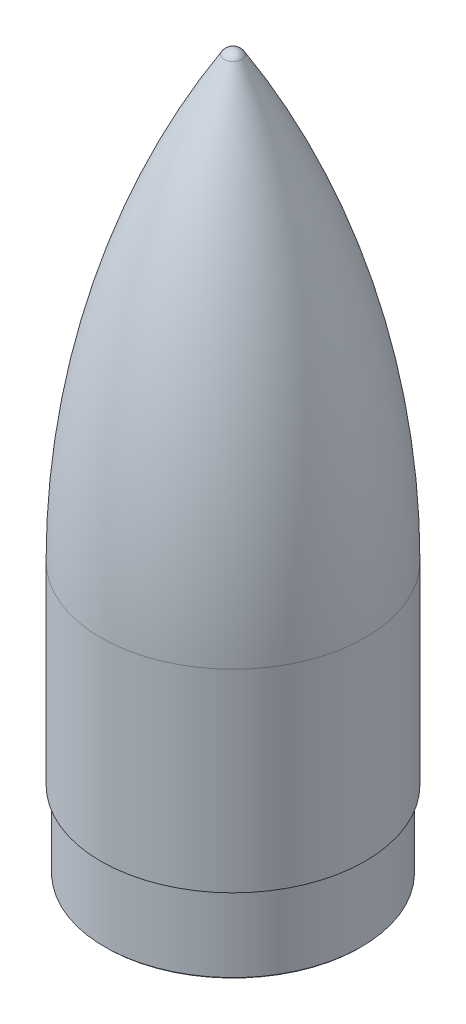
ISO-10303-21;
HEADER;
FILE_DESCRIPTION(('STEP AP214'),'2;1');
FILE_NAME('part.step','',(''),(''),'','','');
FILE_SCHEMA(('AUTOMOTIVE_DESIGN { 1 0 10303 214 1 1 1 1 }'));
ENDSEC;
DATA;
#1=APPLICATION_CONTEXT('core data for automotive mechanical design processes');
#2=APPLICATION_PROTOCOL_DEFINITION('international standard','automotive_design',2000,#1);
#3=PRODUCT_CONTEXT('',#1,'mechanical');
#4=PRODUCT('Part','Part','',(#3));
#5=PRODUCT_RELATED_PRODUCT_CATEGORY('part','',(#4));
#6=PRODUCT_DEFINITION_FORMATION('','',#4);
#7=PRODUCT_DEFINITION_CONTEXT('part definition',#1,'design');
#8=PRODUCT_DEFINITION('design','',#6,#7);
#9=PRODUCT_DEFINITION_SHAPE('','',#8);
#10=(LENGTH_UNIT() NAMED_UNIT(*) SI_UNIT(.MILLI.,.METRE.));
#11=(NAMED_UNIT(*) PLANE_ANGLE_UNIT() SI_UNIT($,.RADIAN.));
#12=(NAMED_UNIT(*) SI_UNIT($,.STERADIAN.) SOLID_ANGLE_UNIT());
#13=UNCERTAINTY_MEASURE_WITH_UNIT(LENGTH_MEASURE(1.E-05),#10,'distance_accuracy_value','');
#14=(GEOMETRIC_REPRESENTATION_CONTEXT(3) GLOBAL_UNCERTAINTY_ASSIGNED_CONTEXT((#13)) GLOBAL_UNIT_ASSIGNED_CONTEXT((#10,
#11,#12)) REPRESENTATION_CONTEXT('',''));
#15=CARTESIAN_POINT('',(0.,0.,0.));
#16=DIRECTION('',(0.,0.,1.));
#17=DIRECTION('',(1.,0.,0.));
#18=AXIS2_PLACEMENT_3D('',#15,#16,#17);
#19=CARTESIAN_POINT('',(49.7,0.,0.));
#20=DIRECTION('',(0.,-1.,0.));
#21=DIRECTION('',(0.,0.,-1.));
#22=AXIS2_PLACEMENT_3D('',#19,#20,#21);
#23=PLANE('',#22);
#24=CARTESIAN_POINT('',(0.,0.,0.));
#25=DIRECTION('',(0.,-1.,0.));
#26=DIRECTION('',(0.,0.,-1.));
#27=AXIS2_PLACEMENT_3D('',#24,#25,#26);
#28=CIRCLE('',#27,49.1999999999999);
#29=CARTESIAN_POINT('',(0.,0.,-49.1999999999999));
#30=VERTEX_POINT('',#29);
#31=EDGE_CURVE('E121',#30,#30,#28,.T.);
#32=ORIENTED_EDGE('',*,*,#31,.T.);
#33=EDGE_LOOP('',(#32));
#34=FACE_BOUND('',#33,.T.);
#35=CARTESIAN_POINT('',(0.,0.,0.));
#36=DIRECTION('',(0.,-1.,0.));
#37=DIRECTION('',(0.,0.,-1.));
#38=AXIS2_PLACEMENT_3D('',#35,#36,#37);
#39=CIRCLE('',#38,46.7);
#40=CARTESIAN_POINT('',(0.,0.,-46.7));
#41=VERTEX_POINT('',#40);
#42=EDGE_CURVE('E139',#41,#41,#39,.T.);
#43=ORIENTED_EDGE('',*,*,#42,.F.);
#44=EDGE_LOOP('',(#43));
#45=FACE_BOUND('',#44,.T.);
#46=ADVANCED_FACE('F34',(#34,#45),#23,.T.);
#47=CARTESIAN_POINT('',(0.,0.,0.));
#48=DIRECTION('',(0.,-1.,0.));
#49=DIRECTION('',(0.,0.,-1.));
#50=AXIS2_PLACEMENT_3D('',#47,#48,#49);
#51=CYLINDRICAL_SURFACE('',#50,49.7);
#52=CARTESIAN_POINT('',(0.,0.50000000000003,0.));
#53=DIRECTION('',(0.,-1.,0.));
#54=DIRECTION('',(0.,0.,-1.));
#55=AXIS2_PLACEMENT_3D('',#52,#53,#54);
#56=CIRCLE('',#55,49.7);
#57=CARTESIAN_POINT('',(0.,0.50000000000003,-49.7));
#58=VERTEX_POINT('',#57);
#59=EDGE_CURVE('E118',#58,#58,#56,.F.);
#60=ORIENTED_EDGE('',*,*,#59,.T.);
#61=EDGE_LOOP('',(#60));
#62=FACE_BOUND('',#61,.T.);
#63=CARTESIAN_POINT('',(0.,30.,0.));
#64=DIRECTION('',(0.,-1.,0.));
#65=DIRECTION('',(0.,0.,-1.));
#66=AXIS2_PLACEMENT_3D('',#63,#64,#65);
#67=CIRCLE('',#66,49.7);
#68=CARTESIAN_POINT('',(0.,30.,-49.7));
#69=VERTEX_POINT('',#68);
#70=EDGE_CURVE('E127',#69,#69,#67,.T.);
#71=ORIENTED_EDGE('',*,*,#70,.T.);
#72=EDGE_LOOP('',(#71));
#73=FACE_BOUND('',#72,.T.);
#74=ADVANCED_FACE('F158',(#62,#73),#51,.T.);
#75=CARTESIAN_POINT('',(49.7,30.,0.));
#76=DIRECTION('',(0.,-1.,0.));
#77=DIRECTION('',(0.,0.,-1.));
#78=AXIS2_PLACEMENT_3D('',#75,#76,#77);
#79=PLANE('',#78);
#80=CARTESIAN_POINT('',(0.,30.,0.));
#81=DIRECTION('',(0.,-1.,0.));
#82=DIRECTION('',(0.,0.,-1.));
#83=AXIS2_PLACEMENT_3D('',#80,#81,#82);
#84=CIRCLE('',#83,51.2);
#85=CARTESIAN_POINT('',(0.,30.,-51.2));
#86=VERTEX_POINT('',#85);
#87=EDGE_CURVE('E130',#86,#86,#84,.T.);
#88=ORIENTED_EDGE('',*,*,#87,.T.);
#89=EDGE_LOOP('',(#88));
#90=FACE_BOUND('',#89,.T.);
#91=ORIENTED_EDGE('',*,*,#70,.F.);
#92=EDGE_LOOP('',(#91));
#93=FACE_BOUND('',#92,.T.);
#94=ADVANCED_FACE('F164',(#90,#93),#79,.T.);
#95=CARTESIAN_POINT('',(0.,0.,0.));
#96=DIRECTION('',(0.,-1.,0.));
#97=DIRECTION('',(0.,0.,-1.));
#98=AXIS2_PLACEMENT_3D('',#95,#96,#97);
#99=CYLINDRICAL_SURFACE('',#98,51.2);
#100=CARTESIAN_POINT('',(0.,54.,0.));
#101=DIRECTION('',(0.,0.5,0.866025403784439));
#102=DIRECTION('',(0.,-0.866025403784439,0.5));
#103=AXIS2_PLACEMENT_3D('',#100,#101,#102);
#104=ELLIPSE('',#103,102.4,51.2);
#105=CARTESIAN_POINT('',(-51.2,54.,0.));
#106=VERTEX_POINT('',#105);
#107=CARTESIAN_POINT('',(-51.1706947382972,51.,1.73205080756888));
#108=VERTEX_POINT('',#107);
#109=EDGE_CURVE('E79',#106,#108,#104,.T.);
#110=ORIENTED_EDGE('',*,*,#109,.T.);
#111=CARTESIAN_POINT('',(-51.1706947382972,51.,1.73205080756888));
#112=CARTESIAN_POINT('',(-51.1697427270834,50.9512981561705,1.76016838132904));
#113=CARTESIAN_POINT('',(-51.1688381000891,50.901432614944,1.78621821485471));
#114=CARTESIAN_POINT('',(-51.1671468144892,50.7996871430818,1.83402923090942));
#115=CARTESIAN_POINT('',(-51.1663601506634,50.7478073017126,1.85579060322848));
#116=CARTESIAN_POINT('',(-51.1642140484645,50.5897762579306,1.91435383585504));
#117=CARTESIAN_POINT('',(-51.1630653365852,50.4810772316997,1.94452485163657));
#118=CARTESIAN_POINT('',(-51.1614645940316,50.2601552139265,1.98619702625711));
#119=CARTESIAN_POINT('',(-51.1610128996041,50.1479305482063,1.99768917440332));
#120=CARTESIAN_POINT('',(-51.1608569670757,49.9231520314851,2.00167918453755));
#121=CARTESIAN_POINT('',(-51.1611525758249,49.8105982526534,1.99418093835364));
#122=CARTESIAN_POINT('',(-51.1624576923682,49.5883873435847,1.96040901332794));
#123=CARTESIAN_POINT('',(-51.163466980732,49.4787293337527,1.93414110543971));
#124=CARTESIAN_POINT('',(-51.1660854771632,49.2653621369059,1.86358107581268));
#125=CARTESIAN_POINT('',(-51.1676947793993,49.1616538866202,1.81928612473603));
#126=CARTESIAN_POINT('',(-51.1713324823789,48.9631125556022,1.71391343164986));
#127=CARTESIAN_POINT('',(-51.1733610154051,48.8682822899579,1.65283039036692));
#128=CARTESIAN_POINT('',(-51.177608162499,48.6902239788753,1.51562481062882));
#129=CARTESIAN_POINT('',(-51.1798267653368,48.6069952487498,1.43950316034803));
#130=CARTESIAN_POINT('',(-51.1842058495242,48.454438230109,1.27431827930633));
#131=CARTESIAN_POINT('',(-51.1863662912608,48.3851192178467,1.1852464800407));
#132=CARTESIAN_POINT('',(-51.1903840727952,48.2624167481332,0.996721645438037));
#133=CARTESIAN_POINT('',(-51.1922414064547,48.2090336133824,0.897268399932431));
#134=CARTESIAN_POINT('',(-51.1954434073345,48.1197266061165,0.690811722155504));
#135=CARTESIAN_POINT('',(-51.1967881186416,48.0838012321181,0.583808940101248));
#136=CARTESIAN_POINT('',(-51.1988134499465,48.0304272110618,0.365285053247779));
#137=CARTESIAN_POINT('',(-51.199494076732,48.0129783751491,0.253763994643456));
#138=CARTESIAN_POINT('',(-51.2001142735274,47.9970604366005,0.0294492146832383));
#139=CARTESIAN_POINT('',(-51.2000543429302,47.9985785436659,-0.0833435977948391));
#140=CARTESIAN_POINT('',(-51.1992013943829,48.0205201067083,-0.30707213517148));
#141=CARTESIAN_POINT('',(-51.1984083773477,48.0409435390893,-0.418007862387705));
#142=CARTESIAN_POINT('',(-51.1961788447621,48.1001068123995,-0.634849018118409));
#143=CARTESIAN_POINT('',(-51.1947424712293,48.1388426110694,-0.740755551099095));
#144=CARTESIAN_POINT('',(-51.1913879268754,48.2335275988252,-0.944564034600044));
#145=CARTESIAN_POINT('',(-51.1894697528584,48.2894769020969,-1.04246593201606));
#146=CARTESIAN_POINT('',(-51.185366212707,48.4170387786355,-1.22754751353424));
#147=CARTESIAN_POINT('',(-51.1831806922709,48.4886604163369,-1.31472094681927));
#148=CARTESIAN_POINT('',(-51.1787894601471,48.6455179778092,-1.47581063756051));
#149=CARTESIAN_POINT('',(-51.1765837484364,48.730753917089,-1.54972687991427));
#150=CARTESIAN_POINT('',(-51.1723995832855,48.9124709505006,-1.68224016482551));
#151=CARTESIAN_POINT('',(-51.1704212416992,49.0089575327271,-1.7408296853872));
#152=CARTESIAN_POINT('',(-51.1669163966837,49.2104035681261,-1.84097504280213));
#153=CARTESIAN_POINT('',(-51.1653898800052,49.3153627727334,-1.88253137914858));
#154=CARTESIAN_POINT('',(-51.1629615891522,49.530724576811,-1.9474145208519));
#155=CARTESIAN_POINT('',(-51.1620595234269,49.6411246101793,-1.97074983409958));
#156=CARTESIAN_POINT('',(-51.1609808812591,49.864307239385,-1.99855770548171));
#157=CARTESIAN_POINT('',(-51.160804460006,49.9770903396923,-2.00302622868704));
#158=CARTESIAN_POINT('',(-51.1611970396326,50.2017696304485,-1.99297290901983));
#159=CARTESIAN_POINT('',(-51.1617659164243,50.3136659654185,-1.97845422741181));
#160=CARTESIAN_POINT('',(-51.1635850580286,50.5333593704557,-1.9308357519898));
#161=CARTESIAN_POINT('',(-51.164834529594,50.6411610567518,-1.89775758828383));
#162=CARTESIAN_POINT('',(-51.166990358,50.7892083869755,-1.83831393687303));
#163=CARTESIAN_POINT('',(-51.1676770201702,50.8324562018554,-1.81913619704325));
#164=CARTESIAN_POINT('',(-51.1691297442726,50.9174062872799,-1.77780434919564));
#165=CARTESIAN_POINT('',(-51.1698956587564,50.9591112387515,-1.75565574647588));
#166=CARTESIAN_POINT('',(-51.1706947382973,51.,-1.7320508075689));
#167=B_SPLINE_CURVE_WITH_KNOTS('',3,(#111,#112,#113,#114,#115,#116,#117,#118,#119,#120,#121,
#122,#123,#124,#125,#126,#127,#128,#129,#130,#131,#132,#133,#134,#135,#136,#137,#138,#139,#140,
#141,#142,#143,#144,#145,#146,#147,#148,#149,#150,#151,#152,#153,#154,#155,#156,#157,#158,#159,
#160,#161,#162,#163,#164,#165,#166),.UNSPECIFIED.,.F.,.F.,(4,2,2,2,2,2,2,2,2,2,2,2,2,2,2,2,2,2,
2,2,2,2,2,2,2,2,2,4),(0.,0.168628145473781,0.337248826467912,0.673955840980249,1.01082523492762,
1.34762559757183,1.68432245151099,2.0210721702904,2.3579283087058,2.69476455847371,
3.03182469985251,3.36889166621396,3.70592963744686,4.04296416367046,4.37977142399021,
4.71657826393983,5.05331079206724,5.39004555396007,5.72697559091441,6.06390601169347,
6.4010014811084,6.73808706458861,7.07501515937384,7.41201530733527,7.74895935377974,
8.08551152276758,8.22735740343669,8.36894397060716),.UNSPECIFIED.);
#168=CARTESIAN_POINT('',(-51.1706947382972,51.,-1.73205080756888));
#169=VERTEX_POINT('',#168);
#170=EDGE_CURVE('E68',#108,#169,#167,.T.);
#171=ORIENTED_EDGE('',*,*,#170,.T.);
#172=CARTESIAN_POINT('',(0.,54.,0.));
#173=DIRECTION('',(0.,0.5,-0.866025403784439));
#174=DIRECTION('',(0.,-0.866025403784439,-0.5));
#175=AXIS2_PLACEMENT_3D('',#172,#173,#174);
#176=ELLIPSE('',#175,102.4,51.2);
#177=EDGE_CURVE('E83',#169,#106,#176,.T.);
#178=ORIENTED_EDGE('',*,*,#177,.T.);
#179=EDGE_LOOP('',(#110,#171,#178));
#180=FACE_BOUND('',#179,.T.);
#181=CARTESIAN_POINT('',(0.,105.,0.));
#182=DIRECTION('',(0.,-1.,0.));
#183=DIRECTION('',(0.,0.,-1.));
#184=AXIS2_PLACEMENT_3D('',#181,#182,#183);
#185=CIRCLE('',#184,51.2);
#186=CARTESIAN_POINT('',(0.,105.,-51.2));
#187=VERTEX_POINT('',#186);
#188=EDGE_CURVE('E133',#187,#187,#185,.T.);
#189=ORIENTED_EDGE('',*,*,#188,.T.);
#190=EDGE_LOOP('',(#189));
#191=FACE_BOUND('',#190,.T.);
#192=ORIENTED_EDGE('',*,*,#87,.F.);
#193=EDGE_LOOP('',(#192));
#194=FACE_BOUND('',#193,.T.);
#195=ADVANCED_FACE('F81',(#180,#191,#194),#99,.T.);
#196=CARTESIAN_POINT('',(0.,105.,0.));
#197=DIRECTION('',(0.,-1.,0.));
#198=DIRECTION('',(0.,0.,-1.));
#199=AXIS2_PLACEMENT_3D('',#196,#197,#198);
#200=DEGENERATE_TOROIDAL_SURFACE('',#199,275.383050847458,326.583050847458,.F.);
#201=CARTESIAN_POINT('',(0.,275.083184464387,0.));
#202=DIRECTION('',(0.,-1.,0.));
#203=DIRECTION('',(0.,0.,-1.));
#204=AXIS2_PLACEMENT_3D('',#201,#202,#203);
#205=CIRCLE('',#204,3.41472436476742);
#206=CARTESIAN_POINT('',(0.,275.083184464387,-3.41472436476742));
#207=VERTEX_POINT('',#206);
#208=EDGE_CURVE('E136',#207,#207,#205,.T.);
#209=ORIENTED_EDGE('',*,*,#208,.T.);
#210=EDGE_LOOP('',(#209));
#211=FACE_BOUND('',#210,.T.);
#212=ORIENTED_EDGE('',*,*,#188,.F.);
#213=EDGE_LOOP('',(#212));
#214=FACE_BOUND('',#213,.T.);
#215=ADVANCED_FACE('F229',(#211,#214),#200,.F.);
#216=CARTESIAN_POINT('',(0.,273.,0.));
#217=DIRECTION('',(0.,-1.,0.));
#218=DIRECTION('',(1.,0.,0.));
#219=AXIS2_PLACEMENT_3D('',#216,#217,#218);
#220=SPHERICAL_SURFACE('',#219,4.00000000000001);
#221=ORIENTED_EDGE('',*,*,#208,.F.);
#222=EDGE_LOOP('',(#221));
#223=FACE_BOUND('',#222,.T.);
#224=ADVANCED_FACE('F102',(#223),#220,.T.);
#225=CARTESIAN_POINT('',(0.,0.,0.));
#226=DIRECTION('',(0.,-1.,0.));
#227=DIRECTION('',(0.,0.,-1.));
#228=AXIS2_PLACEMENT_3D('',#225,#226,#227);
#229=CYLINDRICAL_SURFACE('',#228,46.7);
#230=CARTESIAN_POINT('',(0.,33.,0.));
#231=DIRECTION('',(0.,-1.,0.));
#232=DIRECTION('',(0.,0.,-1.));
#233=AXIS2_PLACEMENT_3D('',#230,#231,#232);
#234=CIRCLE('',#233,46.7);
#235=CARTESIAN_POINT('',(0.,33.,-46.7));
#236=VERTEX_POINT('',#235);
#237=EDGE_CURVE('E142',#236,#236,#234,.T.);
#238=ORIENTED_EDGE('',*,*,#237,.F.);
#239=EDGE_LOOP('',(#238));
#240=FACE_BOUND('',#239,.T.);
#241=ORIENTED_EDGE('',*,*,#42,.T.);
#242=EDGE_LOOP('',(#241));
#243=FACE_BOUND('',#242,.T.);
#244=ADVANCED_FACE('F98',(#240,#243),#229,.F.);
#245=CARTESIAN_POINT('',(0.,0.,0.));
#246=DIRECTION('',(0.,-1.,0.));
#247=DIRECTION('',(0.,0.,-1.));
#248=AXIS2_PLACEMENT_3D('',#245,#246,#247);
#249=CYLINDRICAL_SURFACE('',#248,48.2);
#250=CARTESIAN_POINT('',(-48.1688696151363,51.,-1.73205080756888));
#251=CARTESIAN_POINT('',(-48.1678583503535,50.9513017356797,-1.76016631244853));
#252=CARTESIAN_POINT('',(-48.1668974092647,50.9014398525083,-1.78621443865151));
#253=CARTESIAN_POINT('',(-48.1651008190713,50.7997017225741,-1.83402275540586));
#254=CARTESIAN_POINT('',(-48.1642651644806,50.7478255641396,-1.85578313372633));
#255=CARTESIAN_POINT('',(-48.1619853745316,50.5898053017371,-1.91434446977688));
#256=CARTESIAN_POINT('',(-48.1607650567033,50.4811132745462,-1.94451557214089));
#257=CARTESIAN_POINT('',(-48.1590644269188,50.2602043165468,-1.98619024857829));
#258=CARTESIAN_POINT('',(-48.1585844738401,50.1479857031679,-1.99768476968143));
#259=CARTESIAN_POINT('',(-48.158418544123,49.9232187980444,-2.00168142043709));
#260=CARTESIAN_POINT('',(-48.1587324039101,49.8106705789925,-1.99418746288592));
#261=CARTESIAN_POINT('',(-48.1601184302285,49.5884750250057,-1.9604268033079));
#262=CARTESIAN_POINT('',(-48.1611903315611,49.4788266894684,-1.93416666653917));
#263=CARTESIAN_POINT('',(-48.1639713455955,49.2654774351934,-1.86362583288889));
#264=CARTESIAN_POINT('',(-48.1656805587479,49.1617774569881,-1.81934229512562));
#265=CARTESIAN_POINT('',(-48.1695442465471,48.9632456638234,-1.71399348065297));
#266=CARTESIAN_POINT('',(-48.1716988822623,48.8684170749019,-1.6529221306864));
#267=CARTESIAN_POINT('',(-48.1762101331857,48.6903595366813,-1.51574136799696));
#268=CARTESIAN_POINT('',(-48.1785667365539,48.6071299081679,-1.43963283645591));
#269=CARTESIAN_POINT('',(-48.1832185212285,48.4545613788149,-1.27446773536455));
#270=CARTESIAN_POINT('',(-48.1855136553099,48.3852329067729,-1.1854015306219));
#271=CARTESIAN_POINT('',(-48.1897820563726,48.2625106129721,-0.996885455682113));
#272=CARTESIAN_POINT('',(-48.1917553168516,48.2091171131086,-0.897435375779627));
#273=CARTESIAN_POINT('',(-48.1951573137366,48.1197895273405,-0.690983191724586));
#274=CARTESIAN_POINT('',(-48.1965861023347,48.0838537678788,-0.583981812591416));
#275=CARTESIAN_POINT('',(-48.198738285049,48.0304591953578,-0.365458155143437));
#276=CARTESIAN_POINT('',(-48.1994616867997,48.0130001823255,-0.253935925771143));
#277=CARTESIAN_POINT('',(-48.2001212598744,47.9970634410379,-0.0296266204706755));
#278=CARTESIAN_POINT('',(-48.200058029949,47.99857127603,0.0831594281650355));
#279=CARTESIAN_POINT('',(-48.1991529227016,48.0204901043158,0.306876091430086));
#280=CARTESIAN_POINT('',(-48.198311046495,48.0409010705289,0.417806708717279));
#281=CARTESIAN_POINT('',(-48.1959437802664,48.1000363994581,0.634636349210935));
#282=CARTESIAN_POINT('',(-48.1944185604917,48.1387562008699,0.740536618407321));
#283=CARTESIAN_POINT('',(-48.1908562786505,48.23340617689,0.944335538956895));
#284=CARTESIAN_POINT('',(-48.1888192129275,48.2893364744454,1.04223413314199));
#285=CARTESIAN_POINT('',(-48.1844609206728,48.4168627282182,1.227320077019));
#286=CARTESIAN_POINT('',(-48.1821395091388,48.4884689076487,1.31450037843657));
#287=CARTESIAN_POINT('',(-48.1774749642253,48.6452963763096,1.47560688698489));
#288=CARTESIAN_POINT('',(-48.1751318308125,48.7305176863579,1.54953307384926));
#289=CARTESIAN_POINT('',(-48.1706865450207,48.9122130257938,1.68207357121014));
#290=CARTESIAN_POINT('',(-48.1685845261701,49.008693231232,1.74067942010742));
#291=CARTESIAN_POINT('',(-48.1648602850369,49.2101304241482,1.84085807507559));
#292=CARTESIAN_POINT('',(-48.1632380485943,49.3150871613399,1.88243138384617));
#293=CARTESIAN_POINT('',(-48.1606572260107,49.5304428807106,1.94734656252329));
#294=CARTESIAN_POINT('',(-48.1596982990217,49.6408390365026,1.97069779680963));
#295=CARTESIAN_POINT('',(-48.15855110137,49.8640169920391,1.99853795415413));
#296=CARTESIAN_POINT('',(-48.1583629946503,49.9767992941583,2.00302286460419));
#297=CARTESIAN_POINT('',(-48.1587786781629,50.2014702107081,1.9930026583506));
#298=CARTESIAN_POINT('',(-48.1593822706813,50.313359041249,1.97850228291222));
#299=CARTESIAN_POINT('',(-48.1613132859275,50.5330406180188,1.93092320930836));
#300=CARTESIAN_POINT('',(-48.1626398677945,50.6408379672934,1.89786609191684));
#301=CARTESIAN_POINT('',(-48.1649299222839,50.7889404491169,1.83843045791447));
#302=CARTESIAN_POINT('',(-48.1656601181848,50.8322444658998,1.81923459646463));
#303=CARTESIAN_POINT('',(-48.1672050804568,50.9173032949149,1.77785904378443));
#304=CARTESIAN_POINT('',(-48.1680196896859,50.9590607960953,1.75568487488634));
#305=CARTESIAN_POINT('',(-48.1688696151363,51.,1.7320508075689));
#306=B_SPLINE_CURVE_WITH_KNOTS('',3,(#250,#251,#252,#253,#254,#255,#256,#257,#258,#259,#260,
#261,#262,#263,#264,#265,#266,#267,#268,#269,#270,#271,#272,#273,#274,#275,#276,#277,#278,#279,
#280,#281,#282,#283,#284,#285,#286,#287,#288,#289,#290,#291,#292,#293,#294,#295,#296,#297,#298,
#299,#300,#301,#302,#303,#304,#305),.UNSPECIFIED.,.F.,.F.,(4,2,2,2,2,2,2,2,2,2,2,2,2,2,2,2,2,2,
2,2,2,2,2,2,2,2,2,4),(0.,0.168618871655167,0.337230357508959,0.673919544397111,1.0107718836755,
1.34755481626667,1.68421998460178,2.02093823928576,2.35777846781293,2.69459896328697,
3.031671207413,3.36875026012714,3.70579699294231,4.04284007787917,4.37962663558633,
4.71641271081497,5.0531149262564,5.38981954706204,5.72674441144586,6.06366979100471,
6.40078086703664,6.73788199282979,7.07480976702778,7.41180919751651,7.7487244839485,
8.08524876024392,8.22727233067117,8.36903610777024),.UNSPECIFIED.);
#307=CARTESIAN_POINT('',(-48.1688696151363,51.,-1.73205080756888));
#308=VERTEX_POINT('',#307);
#309=CARTESIAN_POINT('',(-48.1688696151363,51.,1.73205080756888));
#310=VERTEX_POINT('',#309);
#311=EDGE_CURVE('E42',#308,#310,#306,.T.);
#312=ORIENTED_EDGE('',*,*,#311,.T.);
#313=CARTESIAN_POINT('',(0.,54.,0.));
#314=DIRECTION('',(0.,0.5,0.866025403784439));
#315=DIRECTION('',(0.,-0.866025403784439,0.5));
#316=AXIS2_PLACEMENT_3D('',#313,#314,#315);
#317=ELLIPSE('',#316,96.4000000000001,48.2);
#318=CARTESIAN_POINT('',(-48.2,54.,0.));
#319=VERTEX_POINT('',#318);
#320=EDGE_CURVE('E11',#310,#319,#317,.F.);
#321=ORIENTED_EDGE('',*,*,#320,.T.);
#322=CARTESIAN_POINT('',(0.,54.,0.));
#323=DIRECTION('',(0.,0.5,-0.866025403784439));
#324=DIRECTION('',(0.,-0.866025403784439,-0.5));
#325=AXIS2_PLACEMENT_3D('',#322,#323,#324);
#326=ELLIPSE('',#325,96.4000000000001,48.2);
#327=EDGE_CURVE('E115',#319,#308,#326,.F.);
#328=ORIENTED_EDGE('',*,*,#327,.T.);
#329=EDGE_LOOP('',(#312,#321,#328));
#330=FACE_BOUND('',#329,.T.);
#331=CARTESIAN_POINT('',(0.,35.5980762113533,0.));
#332=DIRECTION('',(0.,-1.,0.));
#333=DIRECTION('',(0.,0.,-1.));
#334=AXIS2_PLACEMENT_3D('',#331,#332,#333);
#335=CIRCLE('',#334,48.2);
#336=CARTESIAN_POINT('',(0.,35.5980762113533,-48.2));
#337=VERTEX_POINT('',#336);
#338=EDGE_CURVE('E124',#337,#337,#335,.T.);
#339=ORIENTED_EDGE('',*,*,#338,.T.);
#340=EDGE_LOOP('',(#339));
#341=FACE_BOUND('',#340,.T.);
#342=CARTESIAN_POINT('',(0.,105.,0.));
#343=DIRECTION('',(0.,-1.,0.));
#344=DIRECTION('',(0.,0.,-1.));
#345=AXIS2_PLACEMENT_3D('',#342,#343,#344);
#346=CIRCLE('',#345,48.2);
#347=CARTESIAN_POINT('',(0.,105.,-48.2));
#348=VERTEX_POINT('',#347);
#349=EDGE_CURVE('E146',#348,#348,#346,.T.);
#350=ORIENTED_EDGE('',*,*,#349,.F.);
#351=EDGE_LOOP('',(#350));
#352=FACE_BOUND('',#351,.T.);
#353=ADVANCED_FACE('F101',(#330,#341,#352),#249,.F.);
#354=CARTESIAN_POINT('',(0.,105.,0.));
#355=DIRECTION('',(0.,-1.,0.));
#356=DIRECTION('',(0.,0.,-1.));
#357=AXIS2_PLACEMENT_3D('',#354,#355,#356);
#358=DEGENERATE_TOROIDAL_SURFACE('',#357,275.383050847458,323.583050847458,.F.);
#359=CARTESIAN_POINT('',(0.,273.520796116097,0.));
#360=DIRECTION('',(0.,-1.,0.));
#361=DIRECTION('',(0.,0.,-1.));
#362=AXIS2_PLACEMENT_3D('',#359,#360,#361);
#363=CIRCLE('',#362,0.853681091191827);
#364=CARTESIAN_POINT('',(0.,273.520796116097,-0.853681091191827));
#365=VERTEX_POINT('',#364);
#366=EDGE_CURVE('E143',#365,#365,#363,.T.);
#367=ORIENTED_EDGE('',*,*,#366,.F.);
#368=EDGE_LOOP('',(#367));
#369=FACE_BOUND('',#368,.T.);
#370=ORIENTED_EDGE('',*,*,#349,.T.);
#371=EDGE_LOOP('',(#370));
#372=FACE_BOUND('',#371,.T.);
#373=ADVANCED_FACE('F107',(#369,#372),#358,.T.);
#374=CARTESIAN_POINT('',(0.,273.,0.));
#375=DIRECTION('',(0.,-1.,0.));
#376=DIRECTION('',(1.,0.,0.));
#377=AXIS2_PLACEMENT_3D('',#374,#375,#376);
#378=SPHERICAL_SURFACE('',#377,1.00000000000001);
#379=ORIENTED_EDGE('',*,*,#366,.T.);
#380=EDGE_LOOP('',(#379));
#381=FACE_BOUND('',#380,.T.);
#382=ADVANCED_FACE('F171',(#381),#378,.F.);
#383=CARTESIAN_POINT('',(0.,35.5980762113533,0.));
#384=DIRECTION('',(0.,-1.,0.));
#385=DIRECTION('',(0.,0.,-1.));
#386=AXIS2_PLACEMENT_3D('',#383,#384,#385);
#387=TOROIDAL_SURFACE('',#386,45.2,3.);
#388=ORIENTED_EDGE('',*,*,#237,.T.);
#389=EDGE_LOOP('',(#388));
#390=FACE_BOUND('',#389,.T.);
#391=ORIENTED_EDGE('',*,*,#338,.F.);
#392=EDGE_LOOP('',(#391));
#393=FACE_BOUND('',#392,.T.);
#394=ADVANCED_FACE('F169',(#390,#393),#387,.F.);
#395=CARTESIAN_POINT('',(0.,0.,0.));
#396=DIRECTION('',(0.,1.,0.));
#397=DIRECTION('',(0.,0.,1.));
#398=AXIS2_PLACEMENT_3D('',#395,#396,#397);
#399=CONICAL_SURFACE('',#398,49.1999999999999,0.785398163397504);
#400=ORIENTED_EDGE('',*,*,#59,.F.);
#401=EDGE_LOOP('',(#400));
#402=FACE_BOUND('',#401,.T.);
#403=ORIENTED_EDGE('',*,*,#31,.F.);
#404=EDGE_LOOP('',(#403));
#405=FACE_BOUND('',#404,.T.);
#406=ADVANCED_FACE('F36',(#402,#405),#399,.T.);
#407=CARTESIAN_POINT('',(-51.201,51.,1.73205080756888));
#408=DIRECTION('',(0.,0.5,0.866025403784439));
#409=DIRECTION('',(0.,-0.866025403784439,0.5));
#410=AXIS2_PLACEMENT_3D('',#407,#408,#409);
#411=PLANE('',#410);
#412=DIRECTION('',(1.,0.,0.));
#413=VECTOR('',#412,1.);
#414=CARTESIAN_POINT('',(-51.201,51.,1.73205080756888));
#415=LINE('',#414,#413);
#416=EDGE_CURVE('E71',#108,#310,#415,.T.);
#417=ORIENTED_EDGE('',*,*,#416,.F.);
#418=ORIENTED_EDGE('',*,*,#109,.F.);
#419=DIRECTION('',(1.,0.,0.));
#420=VECTOR('',#419,1.);
#421=CARTESIAN_POINT('',(-51.201,54.,0.));
#422=LINE('',#421,#420);
#423=EDGE_CURVE('E49',#106,#319,#422,.T.);
#424=ORIENTED_EDGE('',*,*,#423,.T.);
#425=ORIENTED_EDGE('',*,*,#320,.F.);
#426=EDGE_LOOP('',(#417,#418,#424,#425));
#427=FACE_BOUND('',#426,.T.);
#428=ADVANCED_FACE('F78',(#427),#411,.F.);
#429=CARTESIAN_POINT('',(-51.201,50.,0.));
#430=DIRECTION('',(1.,0.,0.));
#431=DIRECTION('',(0.,0.,-1.));
#432=AXIS2_PLACEMENT_3D('',#429,#430,#431);
#433=CYLINDRICAL_SURFACE('',#432,2.);
#434=DIRECTION('',(1.,0.,0.));
#435=VECTOR('',#434,1.);
#436=CARTESIAN_POINT('',(-51.201,51.,-1.73205080756888));
#437=LINE('',#436,#435);
#438=EDGE_CURVE('E54',#169,#308,#437,.T.);
#439=ORIENTED_EDGE('',*,*,#438,.F.);
#440=ORIENTED_EDGE('',*,*,#170,.F.);
#441=ORIENTED_EDGE('',*,*,#416,.T.);
#442=ORIENTED_EDGE('',*,*,#311,.F.);
#443=EDGE_LOOP('',(#439,#440,#441,#442));
#444=FACE_BOUND('',#443,.T.);
#445=ADVANCED_FACE('F70',(#444),#433,.F.);
#446=CARTESIAN_POINT('',(-51.201,51.,-1.73205080756888));
#447=DIRECTION('',(0.,0.5,-0.866025403784439));
#448=DIRECTION('',(0.,0.866025403784439,0.5));
#449=AXIS2_PLACEMENT_3D('',#446,#447,#448);
#450=PLANE('',#449);
#451=ORIENTED_EDGE('',*,*,#423,.F.);
#452=ORIENTED_EDGE('',*,*,#177,.F.);
#453=ORIENTED_EDGE('',*,*,#438,.T.);
#454=ORIENTED_EDGE('',*,*,#327,.F.);
#455=EDGE_LOOP('',(#451,#452,#453,#454));
#456=FACE_BOUND('',#455,.T.);
#457=ADVANCED_FACE('F152',(#456),#450,.F.);
#458=CLOSED_SHELL('',(#46,#74,#94,#195,#215,#224,#244,#353,#373,#382,#394,#406,#428,#445,#457));
#459=MANIFOLD_SOLID_BREP('B2',#458);
#460=ADVANCED_BREP_SHAPE_REPRESENTATION('',(#18,#459),#14);
#461=SHAPE_DEFINITION_REPRESENTATION(#9,#460);
ENDSEC;
END-ISO-10303-21;
